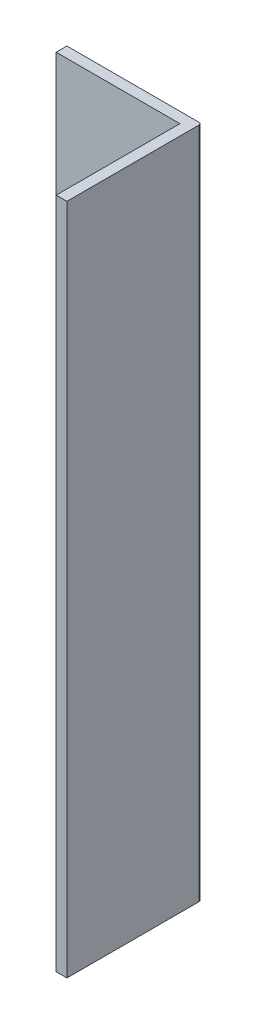
ISO-10303-21;
HEADER;
FILE_DESCRIPTION(('STEP AP214'),'2;1');
FILE_NAME('part.step','',(''),(''),'','','');
FILE_SCHEMA(('AUTOMOTIVE_DESIGN { 1 0 10303 214 1 1 1 1 }'));
ENDSEC;
DATA;
#1=APPLICATION_CONTEXT('core data for automotive mechanical design processes');
#2=APPLICATION_PROTOCOL_DEFINITION('international standard','automotive_design',2000,#1);
#3=PRODUCT_CONTEXT('',#1,'mechanical');
#4=PRODUCT('Part','Part','',(#3));
#5=PRODUCT_RELATED_PRODUCT_CATEGORY('part','',(#4));
#6=PRODUCT_DEFINITION_FORMATION('','',#4);
#7=PRODUCT_DEFINITION_CONTEXT('part definition',#1,'design');
#8=PRODUCT_DEFINITION('design','',#6,#7);
#9=PRODUCT_DEFINITION_SHAPE('','',#8);
#10=(LENGTH_UNIT() NAMED_UNIT(*) SI_UNIT(.MILLI.,.METRE.));
#11=(NAMED_UNIT(*) PLANE_ANGLE_UNIT() SI_UNIT($,.RADIAN.));
#12=(NAMED_UNIT(*) SI_UNIT($,.STERADIAN.) SOLID_ANGLE_UNIT());
#13=UNCERTAINTY_MEASURE_WITH_UNIT(LENGTH_MEASURE(1.E-05),#10,'distance_accuracy_value','');
#14=(GEOMETRIC_REPRESENTATION_CONTEXT(3) GLOBAL_UNCERTAINTY_ASSIGNED_CONTEXT((#13)) GLOBAL_UNIT_ASSIGNED_CONTEXT((#10,
#11,#12)) REPRESENTATION_CONTEXT('',''));
#15=CARTESIAN_POINT('',(0.,0.,0.));
#16=DIRECTION('',(0.,0.,1.));
#17=DIRECTION('',(1.,0.,0.));
#18=AXIS2_PLACEMENT_3D('',#15,#16,#17);
#19=CARTESIAN_POINT('',(-23.,125.,-25.));
#20=DIRECTION('',(1.,0.,0.));
#21=DIRECTION('',(0.,0.,-1.));
#22=AXIS2_PLACEMENT_3D('',#19,#20,#21);
#23=PLANE('',#22);
#24=DIRECTION('',(0.,0.,1.));
#25=VECTOR('',#24,1.);
#26=CARTESIAN_POINT('',(-23.,0.,-25.));
#27=LINE('',#26,#25);
#28=CARTESIAN_POINT('',(-23.,0.,-25.));
#29=VERTEX_POINT('',#28);
#30=CARTESIAN_POINT('',(-23.,0.,-23.));
#31=VERTEX_POINT('',#30);
#32=EDGE_CURVE('E133',#29,#31,#27,.T.);
#33=ORIENTED_EDGE('',*,*,#32,.T.);
#34=DIRECTION('',(0.,-1.,0.));
#35=VECTOR('',#34,1.);
#36=CARTESIAN_POINT('',(-23.,125.,-23.));
#37=LINE('',#36,#35);
#38=CARTESIAN_POINT('',(-23.,125.,-23.));
#39=VERTEX_POINT('',#38);
#40=EDGE_CURVE('E11',#39,#31,#37,.T.);
#41=ORIENTED_EDGE('',*,*,#40,.F.);
#42=DIRECTION('',(0.,0.,1.));
#43=VECTOR('',#42,1.);
#44=CARTESIAN_POINT('',(-23.,125.,-25.));
#45=LINE('',#44,#43);
#46=CARTESIAN_POINT('',(-23.,125.,-25.));
#47=VERTEX_POINT('',#46);
#48=EDGE_CURVE('E145',#47,#39,#45,.T.);
#49=ORIENTED_EDGE('',*,*,#48,.F.);
#50=DIRECTION('',(0.,-1.,0.));
#51=VECTOR('',#50,1.);
#52=CARTESIAN_POINT('',(-23.,125.,-25.));
#53=LINE('',#52,#51);
#54=EDGE_CURVE('E129',#47,#29,#53,.T.);
#55=ORIENTED_EDGE('',*,*,#54,.T.);
#56=EDGE_LOOP('',(#33,#41,#49,#55));
#57=FACE_BOUND('',#56,.T.);
#58=ADVANCED_FACE('F43',(#57),#23,.F.);
#59=CARTESIAN_POINT('',(-23.,125.,-23.));
#60=DIRECTION('',(0.,0.,-1.));
#61=DIRECTION('',(-1.,0.,0.));
#62=AXIS2_PLACEMENT_3D('',#59,#60,#61);
#63=PLANE('',#62);
#64=DIRECTION('',(1.,0.,0.));
#65=VECTOR('',#64,1.);
#66=CARTESIAN_POINT('',(-23.,0.,-23.));
#67=LINE('',#66,#65);
#68=CARTESIAN_POINT('',(0.,0.,-23.));
#69=VERTEX_POINT('',#68);
#70=EDGE_CURVE('E136',#31,#69,#67,.T.);
#71=ORIENTED_EDGE('',*,*,#70,.T.);
#72=DIRECTION('',(0.,-1.,0.));
#73=VECTOR('',#72,1.);
#74=CARTESIAN_POINT('',(0.,125.,-23.));
#75=LINE('',#74,#73);
#76=CARTESIAN_POINT('',(0.,125.,-23.));
#77=VERTEX_POINT('',#76);
#78=EDGE_CURVE('E51',#77,#69,#75,.T.);
#79=ORIENTED_EDGE('',*,*,#78,.F.);
#80=DIRECTION('',(1.,0.,0.));
#81=VECTOR('',#80,1.);
#82=CARTESIAN_POINT('',(-23.,125.,-23.));
#83=LINE('',#82,#81);
#84=EDGE_CURVE('E99',#39,#77,#83,.T.);
#85=ORIENTED_EDGE('',*,*,#84,.F.);
#86=ORIENTED_EDGE('',*,*,#40,.T.);
#87=EDGE_LOOP('',(#71,#79,#85,#86));
#88=FACE_BOUND('',#87,.T.);
#89=ADVANCED_FACE('F170',(#88),#63,.F.);
#90=CARTESIAN_POINT('',(0.,125.,0.));
#91=DIRECTION('',(1.,0.,0.));
#92=DIRECTION('',(0.,0.,-1.));
#93=AXIS2_PLACEMENT_3D('',#90,#91,#92);
#94=PLANE('',#93);
#95=DIRECTION('',(0.,0.,1.));
#96=VECTOR('',#95,1.);
#97=CARTESIAN_POINT('',(0.,0.,0.));
#98=LINE('',#97,#96);
#99=CARTESIAN_POINT('',(0.,0.,0.));
#100=VERTEX_POINT('',#99);
#101=EDGE_CURVE('E138',#69,#100,#98,.T.);
#102=ORIENTED_EDGE('',*,*,#101,.T.);
#103=DIRECTION('',(0.,-1.,0.));
#104=VECTOR('',#103,1.);
#105=CARTESIAN_POINT('',(0.,125.,0.));
#106=LINE('',#105,#104);
#107=CARTESIAN_POINT('',(0.,125.,0.));
#108=VERTEX_POINT('',#107);
#109=EDGE_CURVE('E149',#108,#100,#106,.T.);
#110=ORIENTED_EDGE('',*,*,#109,.F.);
#111=DIRECTION('',(0.,0.,1.));
#112=VECTOR('',#111,1.);
#113=CARTESIAN_POINT('',(0.,125.,0.));
#114=LINE('',#113,#112);
#115=EDGE_CURVE('E157',#77,#108,#114,.T.);
#116=ORIENTED_EDGE('',*,*,#115,.F.);
#117=ORIENTED_EDGE('',*,*,#78,.T.);
#118=EDGE_LOOP('',(#102,#110,#116,#117));
#119=FACE_BOUND('',#118,.T.);
#120=ADVANCED_FACE('F155',(#119),#94,.F.);
#121=CARTESIAN_POINT('',(0.,125.,0.));
#122=DIRECTION('',(0.,0.,-1.));
#123=DIRECTION('',(-1.,0.,0.));
#124=AXIS2_PLACEMENT_3D('',#121,#122,#123);
#125=PLANE('',#124);
#126=DIRECTION('',(1.,0.,0.));
#127=VECTOR('',#126,1.);
#128=CARTESIAN_POINT('',(0.,0.,0.));
#129=LINE('',#128,#127);
#130=CARTESIAN_POINT('',(2.,0.,0.));
#131=VERTEX_POINT('',#130);
#132=EDGE_CURVE('E140',#100,#131,#129,.T.);
#133=ORIENTED_EDGE('',*,*,#132,.T.);
#134=DIRECTION('',(0.,-1.,0.));
#135=VECTOR('',#134,1.);
#136=CARTESIAN_POINT('',(2.,125.,0.));
#137=LINE('',#136,#135);
#138=CARTESIAN_POINT('',(2.,125.,0.));
#139=VERTEX_POINT('',#138);
#140=EDGE_CURVE('E124',#139,#131,#137,.T.);
#141=ORIENTED_EDGE('',*,*,#140,.F.);
#142=DIRECTION('',(1.,0.,0.));
#143=VECTOR('',#142,1.);
#144=CARTESIAN_POINT('',(0.,125.,0.));
#145=LINE('',#144,#143);
#146=EDGE_CURVE('E115',#108,#139,#145,.T.);
#147=ORIENTED_EDGE('',*,*,#146,.F.);
#148=ORIENTED_EDGE('',*,*,#109,.T.);
#149=EDGE_LOOP('',(#133,#141,#147,#148));
#150=FACE_BOUND('',#149,.T.);
#151=ADVANCED_FACE('F163',(#150),#125,.F.);
#152=CARTESIAN_POINT('',(2.,125.,0.));
#153=DIRECTION('',(-1.,0.,0.));
#154=DIRECTION('',(0.,0.,1.));
#155=AXIS2_PLACEMENT_3D('',#152,#153,#154);
#156=PLANE('',#155);
#157=DIRECTION('',(0.,0.,-1.));
#158=VECTOR('',#157,1.);
#159=CARTESIAN_POINT('',(2.,0.,0.));
#160=LINE('',#159,#158);
#161=CARTESIAN_POINT('',(2.,0.,-24.5));
#162=VERTEX_POINT('',#161);
#163=EDGE_CURVE('E123',#131,#162,#160,.T.);
#164=ORIENTED_EDGE('',*,*,#163,.T.);
#165=DIRECTION('',(0.,-1.,0.));
#166=VECTOR('',#165,1.);
#167=CARTESIAN_POINT('',(2.,125.,-24.5));
#168=LINE('',#167,#166);
#169=CARTESIAN_POINT('',(2.,125.,-24.5));
#170=VERTEX_POINT('',#169);
#171=EDGE_CURVE('E120',#170,#162,#168,.T.);
#172=ORIENTED_EDGE('',*,*,#171,.F.);
#173=DIRECTION('',(0.,0.,-1.));
#174=VECTOR('',#173,1.);
#175=CARTESIAN_POINT('',(2.,125.,0.));
#176=LINE('',#175,#174);
#177=EDGE_CURVE('E109',#139,#170,#176,.T.);
#178=ORIENTED_EDGE('',*,*,#177,.F.);
#179=ORIENTED_EDGE('',*,*,#140,.T.);
#180=EDGE_LOOP('',(#164,#172,#178,#179));
#181=FACE_BOUND('',#180,.T.);
#182=ADVANCED_FACE('F121',(#181),#156,.F.);
#183=CARTESIAN_POINT('',(1.5,125.,-24.5));
#184=DIRECTION('',(0.,-1.,0.));
#185=DIRECTION('',(0.,0.,-1.));
#186=AXIS2_PLACEMENT_3D('',#183,#184,#185);
#187=CYLINDRICAL_SURFACE('',#186,0.5);
#188=CARTESIAN_POINT('',(1.5,0.,-24.5));
#189=DIRECTION('',(0.,1.,0.));
#190=DIRECTION('',(0.,0.,-1.));
#191=AXIS2_PLACEMENT_3D('',#188,#189,#190);
#192=CIRCLE('',#191,0.5);
#193=CARTESIAN_POINT('',(1.5,0.,-25.));
#194=VERTEX_POINT('',#193);
#195=EDGE_CURVE('E85',#162,#194,#192,.T.);
#196=ORIENTED_EDGE('',*,*,#195,.T.);
#197=DIRECTION('',(0.,-1.,0.));
#198=VECTOR('',#197,1.);
#199=CARTESIAN_POINT('',(1.5,125.,-25.));
#200=LINE('',#199,#198);
#201=CARTESIAN_POINT('',(1.5,125.,-25.));
#202=VERTEX_POINT('',#201);
#203=EDGE_CURVE('E125',#202,#194,#200,.T.);
#204=ORIENTED_EDGE('',*,*,#203,.F.);
#205=CARTESIAN_POINT('',(1.5,125.,-24.5));
#206=DIRECTION('',(0.,1.,0.));
#207=DIRECTION('',(0.,0.,-1.));
#208=AXIS2_PLACEMENT_3D('',#205,#206,#207);
#209=CIRCLE('',#208,0.5);
#210=EDGE_CURVE('E113',#170,#202,#209,.T.);
#211=ORIENTED_EDGE('',*,*,#210,.F.);
#212=ORIENTED_EDGE('',*,*,#171,.T.);
#213=EDGE_LOOP('',(#196,#204,#211,#212));
#214=FACE_BOUND('',#213,.T.);
#215=ADVANCED_FACE('F127',(#214),#187,.T.);
#216=CARTESIAN_POINT('',(-23.,125.,-25.));
#217=DIRECTION('',(0.,0.,1.));
#218=DIRECTION('',(1.,0.,0.));
#219=AXIS2_PLACEMENT_3D('',#216,#217,#218);
#220=PLANE('',#219);
#221=DIRECTION('',(-1.,0.,0.));
#222=VECTOR('',#221,1.);
#223=CARTESIAN_POINT('',(-23.,0.,-25.));
#224=LINE('',#223,#222);
#225=EDGE_CURVE('E91',#194,#29,#224,.T.);
#226=ORIENTED_EDGE('',*,*,#225,.T.);
#227=ORIENTED_EDGE('',*,*,#54,.F.);
#228=DIRECTION('',(-1.,0.,0.));
#229=VECTOR('',#228,1.);
#230=CARTESIAN_POINT('',(-23.,125.,-25.));
#231=LINE('',#230,#229);
#232=EDGE_CURVE('E59',#202,#47,#231,.T.);
#233=ORIENTED_EDGE('',*,*,#232,.F.);
#234=ORIENTED_EDGE('',*,*,#203,.T.);
#235=EDGE_LOOP('',(#226,#227,#233,#234));
#236=FACE_BOUND('',#235,.T.);
#237=ADVANCED_FACE('F184',(#236),#220,.F.);
#238=CARTESIAN_POINT('',(1.5,125.,-24.5));
#239=DIRECTION('',(0.,-1.,0.));
#240=DIRECTION('',(0.,0.,-1.));
#241=AXIS2_PLACEMENT_3D('',#238,#239,#240);
#242=PLANE('',#241);
#243=ORIENTED_EDGE('',*,*,#48,.T.);
#244=ORIENTED_EDGE('',*,*,#84,.T.);
#245=ORIENTED_EDGE('',*,*,#115,.T.);
#246=ORIENTED_EDGE('',*,*,#146,.T.);
#247=ORIENTED_EDGE('',*,*,#177,.T.);
#248=ORIENTED_EDGE('',*,*,#210,.T.);
#249=ORIENTED_EDGE('',*,*,#232,.T.);
#250=EDGE_LOOP('',(#243,#244,#245,#246,#247,#248,#249));
#251=FACE_BOUND('',#250,.T.);
#252=ADVANCED_FACE('F111',(#251),#242,.F.);
#253=CARTESIAN_POINT('',(1.5,0.,-24.5));
#254=DIRECTION('',(0.,-1.,0.));
#255=DIRECTION('',(0.,0.,-1.));
#256=AXIS2_PLACEMENT_3D('',#253,#254,#255);
#257=PLANE('',#256);
#258=ORIENTED_EDGE('',*,*,#32,.F.);
#259=ORIENTED_EDGE('',*,*,#225,.F.);
#260=ORIENTED_EDGE('',*,*,#195,.F.);
#261=ORIENTED_EDGE('',*,*,#163,.F.);
#262=ORIENTED_EDGE('',*,*,#132,.F.);
#263=ORIENTED_EDGE('',*,*,#101,.F.);
#264=ORIENTED_EDGE('',*,*,#70,.F.);
#265=EDGE_LOOP('',(#258,#259,#260,#261,#262,#263,#264));
#266=FACE_BOUND('',#265,.T.);
#267=ADVANCED_FACE('F161',(#266),#257,.T.);
#268=CLOSED_SHELL('',(#58,#89,#120,#151,#182,#215,#237,#252,#267));
#269=MANIFOLD_SOLID_BREP('B2',#268);
#270=ADVANCED_BREP_SHAPE_REPRESENTATION('',(#18,#269),#14);
#271=SHAPE_DEFINITION_REPRESENTATION(#9,#270);
ENDSEC;
END-ISO-10303-21;
